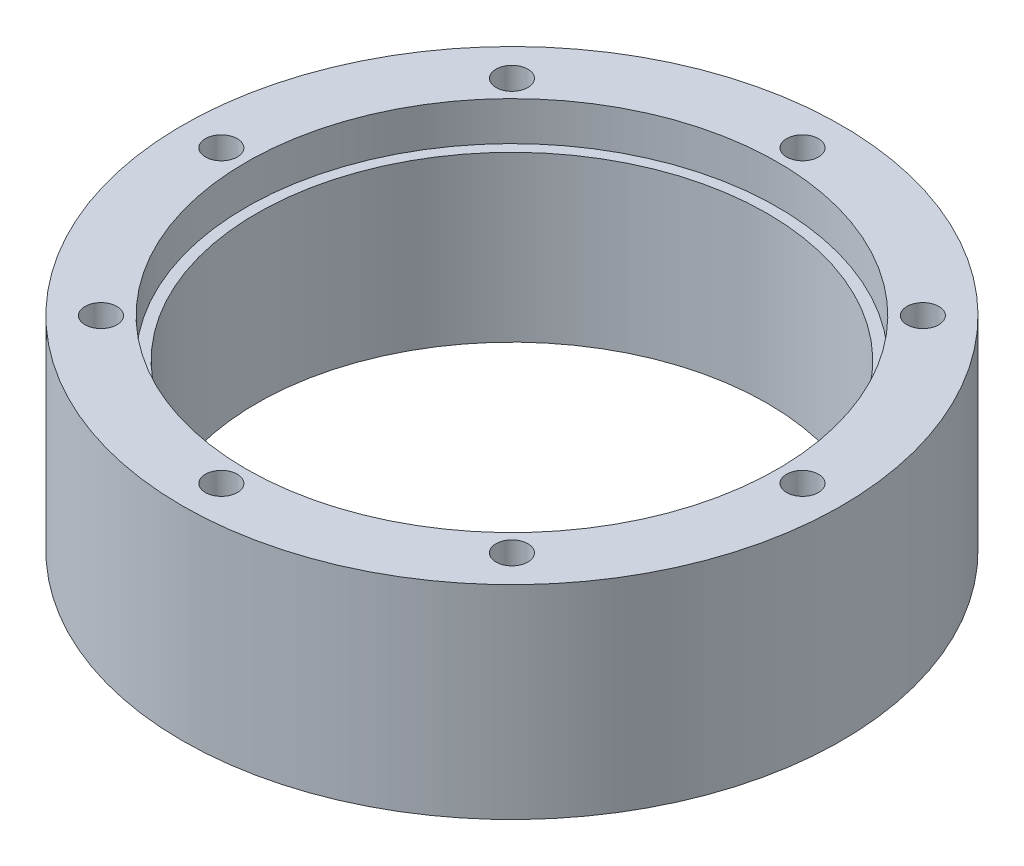
ISO-10303-21;
HEADER;
FILE_DESCRIPTION(('STEP AP214'),'2;1');
FILE_NAME('part.step','',(''),(''),'','','');
FILE_SCHEMA(('AUTOMOTIVE_DESIGN { 1 0 10303 214 1 1 1 1 }'));
ENDSEC;
DATA;
#1=APPLICATION_CONTEXT('core data for automotive mechanical design processes');
#2=APPLICATION_PROTOCOL_DEFINITION('international standard','automotive_design',2000,#1);
#3=PRODUCT_CONTEXT('',#1,'mechanical');
#4=PRODUCT('Part','Part','',(#3));
#5=PRODUCT_RELATED_PRODUCT_CATEGORY('part','',(#4));
#6=PRODUCT_DEFINITION_FORMATION('','',#4);
#7=PRODUCT_DEFINITION_CONTEXT('part definition',#1,'design');
#8=PRODUCT_DEFINITION('design','',#6,#7);
#9=PRODUCT_DEFINITION_SHAPE('','',#8);
#10=(LENGTH_UNIT() NAMED_UNIT(*) SI_UNIT(.MILLI.,.METRE.));
#11=(NAMED_UNIT(*) PLANE_ANGLE_UNIT() SI_UNIT($,.RADIAN.));
#12=(NAMED_UNIT(*) SI_UNIT($,.STERADIAN.) SOLID_ANGLE_UNIT());
#13=UNCERTAINTY_MEASURE_WITH_UNIT(LENGTH_MEASURE(1.E-05),#10,'distance_accuracy_value','');
#14=(GEOMETRIC_REPRESENTATION_CONTEXT(3) GLOBAL_UNCERTAINTY_ASSIGNED_CONTEXT((#13)) GLOBAL_UNIT_ASSIGNED_CONTEXT((#10,
#11,#12)) REPRESENTATION_CONTEXT('',''));
#15=CARTESIAN_POINT('',(0.,0.,0.));
#16=DIRECTION('',(0.,0.,1.));
#17=DIRECTION('',(1.,0.,0.));
#18=AXIS2_PLACEMENT_3D('',#15,#16,#17);
#19=CARTESIAN_POINT('',(0.,28.7,0.));
#20=DIRECTION('',(0.,-1.,0.));
#21=DIRECTION('',(0.,0.,-1.));
#22=AXIS2_PLACEMENT_3D('',#19,#20,#21);
#23=CYLINDRICAL_SURFACE('',#22,36.);
#24=CARTESIAN_POINT('',(0.,0.,0.));
#25=DIRECTION('',(0.,1.,0.));
#26=DIRECTION('',(0.,0.,1.));
#27=AXIS2_PLACEMENT_3D('',#24,#25,#26);
#28=CIRCLE('',#27,36.);
#29=CARTESIAN_POINT('',(0.,0.,36.));
#30=VERTEX_POINT('',#29);
#31=EDGE_CURVE('E54',#30,#30,#28,.T.);
#32=ORIENTED_EDGE('',*,*,#31,.F.);
#33=EDGE_LOOP('',(#32));
#34=FACE_BOUND('',#33,.T.);
#35=CARTESIAN_POINT('',(0.,23.2,0.));
#36=DIRECTION('',(0.,1.,0.));
#37=DIRECTION('',(0.,0.,1.));
#38=AXIS2_PLACEMENT_3D('',#35,#36,#37);
#39=CIRCLE('',#38,36.);
#40=CARTESIAN_POINT('',(0.,23.2,36.));
#41=VERTEX_POINT('',#40);
#42=EDGE_CURVE('E110',#41,#41,#39,.T.);
#43=ORIENTED_EDGE('',*,*,#42,.T.);
#44=EDGE_LOOP('',(#43));
#45=FACE_BOUND('',#44,.T.);
#46=ADVANCED_FACE('F43',(#34,#45),#23,.F.);
#47=CARTESIAN_POINT('',(0.,28.7,0.));
#48=DIRECTION('',(0.,1.,0.));
#49=DIRECTION('',(0.,0.,1.));
#50=AXIS2_PLACEMENT_3D('',#47,#48,#49);
#51=PLANE('',#50);
#52=CARTESIAN_POINT('',(0.,28.7,0.));
#53=DIRECTION('',(0.,1.,0.));
#54=DIRECTION('',(0.,0.,1.));
#55=AXIS2_PLACEMENT_3D('',#52,#53,#54);
#56=CIRCLE('',#55,37.5);
#57=CARTESIAN_POINT('',(0.,28.7,37.5));
#58=VERTEX_POINT('',#57);
#59=EDGE_CURVE('E107',#58,#58,#56,.T.);
#60=ORIENTED_EDGE('',*,*,#59,.F.);
#61=EDGE_LOOP('',(#60));
#62=FACE_BOUND('',#61,.T.);
#63=CARTESIAN_POINT('',(0.,28.7,-41.));
#64=DIRECTION('',(0.,1.,0.));
#65=DIRECTION('',(0.,0.,1.));
#66=AXIS2_PLACEMENT_3D('',#63,#64,#65);
#67=CIRCLE('',#66,2.25);
#68=CARTESIAN_POINT('',(0.,28.7,-38.75));
#69=VERTEX_POINT('',#68);
#70=EDGE_CURVE('E102',#69,#69,#67,.T.);
#71=ORIENTED_EDGE('',*,*,#70,.F.);
#72=EDGE_LOOP('',(#71));
#73=FACE_BOUND('',#72,.T.);
#74=CARTESIAN_POINT('',(28.991378028649,28.7,-28.9913780286484));
#75=DIRECTION('',(0.,1.,0.));
#76=DIRECTION('',(0.,0.,1.));
#77=AXIS2_PLACEMENT_3D('',#74,#75,#76);
#78=CIRCLE('',#77,2.25);
#79=CARTESIAN_POINT('',(28.991378028649,28.7,-26.7413780286484));
#80=VERTEX_POINT('',#79);
#81=EDGE_CURVE('E99',#80,#80,#78,.T.);
#82=ORIENTED_EDGE('',*,*,#81,.F.);
#83=EDGE_LOOP('',(#82));
#84=FACE_BOUND('',#83,.T.);
#85=CARTESIAN_POINT('',(41.0000000000009,28.7,3.57978890157532E-13));
#86=DIRECTION('',(0.,1.,0.));
#87=DIRECTION('',(0.,0.,1.));
#88=AXIS2_PLACEMENT_3D('',#85,#86,#87);
#89=CIRCLE('',#88,2.25);
#90=CARTESIAN_POINT('',(41.0000000000009,28.7,2.25000000000036));
#91=VERTEX_POINT('',#90);
#92=EDGE_CURVE('E93',#91,#91,#89,.T.);
#93=ORIENTED_EDGE('',*,*,#92,.F.);
#94=EDGE_LOOP('',(#93));
#95=FACE_BOUND('',#94,.T.);
#96=CARTESIAN_POINT('',(28.9913780286484,28.7,28.9913780286484));
#97=DIRECTION('',(0.,1.,0.));
#98=DIRECTION('',(0.,0.,1.));
#99=AXIS2_PLACEMENT_3D('',#96,#97,#98);
#100=CIRCLE('',#99,2.25);
#101=CARTESIAN_POINT('',(28.9913780286484,28.7,31.2413780286484));
#102=VERTEX_POINT('',#101);
#103=EDGE_CURVE('E87',#102,#102,#100,.T.);
#104=ORIENTED_EDGE('',*,*,#103,.F.);
#105=EDGE_LOOP('',(#104));
#106=FACE_BOUND('',#105,.T.);
#107=CARTESIAN_POINT('',(0.,28.7,41.));
#108=DIRECTION('',(0.,1.,0.));
#109=DIRECTION('',(0.,0.,1.));
#110=AXIS2_PLACEMENT_3D('',#107,#108,#109);
#111=CIRCLE('',#110,2.25);
#112=CARTESIAN_POINT('',(0.,28.7,43.25));
#113=VERTEX_POINT('',#112);
#114=EDGE_CURVE('E81',#113,#113,#111,.T.);
#115=ORIENTED_EDGE('',*,*,#114,.F.);
#116=EDGE_LOOP('',(#115));
#117=FACE_BOUND('',#116,.T.);
#118=CARTESIAN_POINT('',(-28.9913780286484,28.7,28.9913780286485));
#119=DIRECTION('',(0.,1.,0.));
#120=DIRECTION('',(0.,0.,1.));
#121=AXIS2_PLACEMENT_3D('',#118,#119,#120);
#122=CIRCLE('',#121,2.25);
#123=CARTESIAN_POINT('',(-28.9913780286484,28.7,31.2413780286485));
#124=VERTEX_POINT('',#123);
#125=EDGE_CURVE('E75',#124,#124,#122,.T.);
#126=ORIENTED_EDGE('',*,*,#125,.F.);
#127=EDGE_LOOP('',(#126));
#128=FACE_BOUND('',#127,.T.);
#129=CARTESIAN_POINT('',(-41.,28.7,0.));
#130=DIRECTION('',(0.,1.,0.));
#131=DIRECTION('',(0.,0.,1.));
#132=AXIS2_PLACEMENT_3D('',#129,#130,#131);
#133=CIRCLE('',#132,2.25);
#134=CARTESIAN_POINT('',(-41.,28.7,2.25000000000001));
#135=VERTEX_POINT('',#134);
#136=EDGE_CURVE('E69',#135,#135,#133,.T.);
#137=ORIENTED_EDGE('',*,*,#136,.F.);
#138=EDGE_LOOP('',(#137));
#139=FACE_BOUND('',#138,.T.);
#140=CARTESIAN_POINT('',(-28.9913780286488,28.7,-28.9913780286481));
#141=DIRECTION('',(0.,1.,0.));
#142=DIRECTION('',(0.,0.,1.));
#143=AXIS2_PLACEMENT_3D('',#140,#141,#142);
#144=CIRCLE('',#143,2.25);
#145=CARTESIAN_POINT('',(-28.9913780286488,28.7,-26.7413780286481));
#146=VERTEX_POINT('',#145);
#147=EDGE_CURVE('E62',#146,#146,#144,.T.);
#148=ORIENTED_EDGE('',*,*,#147,.F.);
#149=EDGE_LOOP('',(#148));
#150=FACE_BOUND('',#149,.T.);
#151=CARTESIAN_POINT('',(0.,28.7,0.));
#152=DIRECTION('',(0.,1.,0.));
#153=DIRECTION('',(0.,0.,1.));
#154=AXIS2_PLACEMENT_3D('',#151,#152,#153);
#155=CIRCLE('',#154,46.5);
#156=CARTESIAN_POINT('',(0.,28.7,46.5));
#157=VERTEX_POINT('',#156);
#158=EDGE_CURVE('E10',#157,#157,#155,.T.);
#159=ORIENTED_EDGE('',*,*,#158,.T.);
#160=EDGE_LOOP('',(#159));
#161=FACE_BOUND('',#160,.T.);
#162=ADVANCED_FACE('F130',(#62,#73,#84,#95,#106,#117,#128,#139,#150,#161),#51,.T.);
#163=CARTESIAN_POINT('',(0.,0.,0.));
#164=DIRECTION('',(0.,1.,0.));
#165=DIRECTION('',(0.,0.,1.));
#166=AXIS2_PLACEMENT_3D('',#163,#164,#165);
#167=PLANE('',#166);
#168=CARTESIAN_POINT('',(0.,0.,-41.));
#169=DIRECTION('',(0.,1.,0.));
#170=DIRECTION('',(0.,0.,1.));
#171=AXIS2_PLACEMENT_3D('',#168,#169,#170);
#172=CIRCLE('',#171,2.25);
#173=CARTESIAN_POINT('',(0.,0.,-38.75));
#174=VERTEX_POINT('',#173);
#175=EDGE_CURVE('E58',#174,#174,#172,.T.);
#176=ORIENTED_EDGE('',*,*,#175,.T.);
#177=EDGE_LOOP('',(#176));
#178=FACE_BOUND('',#177,.T.);
#179=CARTESIAN_POINT('',(28.991378028649,0.,-28.9913780286484));
#180=DIRECTION('',(0.,1.,0.));
#181=DIRECTION('',(0.,0.,1.));
#182=AXIS2_PLACEMENT_3D('',#179,#180,#181);
#183=CIRCLE('',#182,2.25);
#184=CARTESIAN_POINT('',(28.991378028649,0.,-26.7413780286484));
#185=VERTEX_POINT('',#184);
#186=EDGE_CURVE('E96',#185,#185,#183,.T.);
#187=ORIENTED_EDGE('',*,*,#186,.T.);
#188=EDGE_LOOP('',(#187));
#189=FACE_BOUND('',#188,.T.);
#190=CARTESIAN_POINT('',(41.0000000000009,0.,3.57978890157532E-13));
#191=DIRECTION('',(0.,1.,0.));
#192=DIRECTION('',(0.,0.,1.));
#193=AXIS2_PLACEMENT_3D('',#190,#191,#192);
#194=CIRCLE('',#193,2.25);
#195=CARTESIAN_POINT('',(41.0000000000009,0.,2.25000000000036));
#196=VERTEX_POINT('',#195);
#197=EDGE_CURVE('E90',#196,#196,#194,.T.);
#198=ORIENTED_EDGE('',*,*,#197,.T.);
#199=EDGE_LOOP('',(#198));
#200=FACE_BOUND('',#199,.T.);
#201=CARTESIAN_POINT('',(28.9913780286484,0.,28.9913780286484));
#202=DIRECTION('',(0.,1.,0.));
#203=DIRECTION('',(0.,0.,1.));
#204=AXIS2_PLACEMENT_3D('',#201,#202,#203);
#205=CIRCLE('',#204,2.25);
#206=CARTESIAN_POINT('',(28.9913780286484,0.,31.2413780286484));
#207=VERTEX_POINT('',#206);
#208=EDGE_CURVE('E84',#207,#207,#205,.T.);
#209=ORIENTED_EDGE('',*,*,#208,.T.);
#210=EDGE_LOOP('',(#209));
#211=FACE_BOUND('',#210,.T.);
#212=CARTESIAN_POINT('',(0.,0.,41.));
#213=DIRECTION('',(0.,1.,0.));
#214=DIRECTION('',(0.,0.,1.));
#215=AXIS2_PLACEMENT_3D('',#212,#213,#214);
#216=CIRCLE('',#215,2.25);
#217=CARTESIAN_POINT('',(0.,0.,43.25));
#218=VERTEX_POINT('',#217);
#219=EDGE_CURVE('E78',#218,#218,#216,.T.);
#220=ORIENTED_EDGE('',*,*,#219,.T.);
#221=EDGE_LOOP('',(#220));
#222=FACE_BOUND('',#221,.T.);
#223=CARTESIAN_POINT('',(-28.9913780286484,0.,28.9913780286485));
#224=DIRECTION('',(0.,1.,0.));
#225=DIRECTION('',(0.,0.,1.));
#226=AXIS2_PLACEMENT_3D('',#223,#224,#225);
#227=CIRCLE('',#226,2.25);
#228=CARTESIAN_POINT('',(-28.9913780286484,0.,31.2413780286485));
#229=VERTEX_POINT('',#228);
#230=EDGE_CURVE('E72',#229,#229,#227,.T.);
#231=ORIENTED_EDGE('',*,*,#230,.T.);
#232=EDGE_LOOP('',(#231));
#233=FACE_BOUND('',#232,.T.);
#234=CARTESIAN_POINT('',(-41.,0.,0.));
#235=DIRECTION('',(0.,1.,0.));
#236=DIRECTION('',(0.,0.,1.));
#237=AXIS2_PLACEMENT_3D('',#234,#235,#236);
#238=CIRCLE('',#237,2.25);
#239=CARTESIAN_POINT('',(-41.,0.,2.25000000000001));
#240=VERTEX_POINT('',#239);
#241=EDGE_CURVE('E66',#240,#240,#238,.T.);
#242=ORIENTED_EDGE('',*,*,#241,.T.);
#243=EDGE_LOOP('',(#242));
#244=FACE_BOUND('',#243,.T.);
#245=CARTESIAN_POINT('',(-28.9913780286488,0.,-28.9913780286481));
#246=DIRECTION('',(0.,1.,0.));
#247=DIRECTION('',(0.,0.,1.));
#248=AXIS2_PLACEMENT_3D('',#245,#246,#247);
#249=CIRCLE('',#248,2.25);
#250=CARTESIAN_POINT('',(-28.9913780286488,0.,-26.7413780286481));
#251=VERTEX_POINT('',#250);
#252=EDGE_CURVE('E59',#251,#251,#249,.T.);
#253=ORIENTED_EDGE('',*,*,#252,.T.);
#254=EDGE_LOOP('',(#253));
#255=FACE_BOUND('',#254,.T.);
#256=CARTESIAN_POINT('',(0.,0.,0.));
#257=DIRECTION('',(0.,1.,0.));
#258=DIRECTION('',(0.,0.,1.));
#259=AXIS2_PLACEMENT_3D('',#256,#257,#258);
#260=CIRCLE('',#259,46.5);
#261=CARTESIAN_POINT('',(0.,0.,46.5));
#262=VERTEX_POINT('',#261);
#263=EDGE_CURVE('E47',#262,#262,#260,.T.);
#264=ORIENTED_EDGE('',*,*,#263,.F.);
#265=EDGE_LOOP('',(#264));
#266=FACE_BOUND('',#265,.T.);
#267=ORIENTED_EDGE('',*,*,#31,.T.);
#268=EDGE_LOOP('',(#267));
#269=FACE_BOUND('',#268,.T.);
#270=ADVANCED_FACE('F133',(#178,#189,#200,#211,#222,#233,#244,#255,#266,#269),#167,.F.);
#271=CARTESIAN_POINT('',(0.,28.7,0.));
#272=DIRECTION('',(0.,-1.,0.));
#273=DIRECTION('',(0.,0.,-1.));
#274=AXIS2_PLACEMENT_3D('',#271,#272,#273);
#275=CYLINDRICAL_SURFACE('',#274,46.5);
#276=ORIENTED_EDGE('',*,*,#158,.F.);
#277=EDGE_LOOP('',(#276));
#278=FACE_BOUND('',#277,.T.);
#279=ORIENTED_EDGE('',*,*,#263,.T.);
#280=EDGE_LOOP('',(#279));
#281=FACE_BOUND('',#280,.T.);
#282=ADVANCED_FACE('F45',(#278,#281),#275,.T.);
#283=CARTESIAN_POINT('',(-28.9913780286488,0.,-28.9913780286481));
#284=DIRECTION('',(0.,1.,0.));
#285=DIRECTION('',(0.,0.,1.));
#286=AXIS2_PLACEMENT_3D('',#283,#284,#285);
#287=CYLINDRICAL_SURFACE('',#286,2.25);
#288=ORIENTED_EDGE('',*,*,#252,.F.);
#289=EDGE_LOOP('',(#288));
#290=FACE_BOUND('',#289,.T.);
#291=ORIENTED_EDGE('',*,*,#147,.T.);
#292=EDGE_LOOP('',(#291));
#293=FACE_BOUND('',#292,.T.);
#294=ADVANCED_FACE('F151',(#290,#293),#287,.F.);
#295=CARTESIAN_POINT('',(-41.,0.,0.));
#296=DIRECTION('',(0.,1.,0.));
#297=DIRECTION('',(0.,0.,1.));
#298=AXIS2_PLACEMENT_3D('',#295,#296,#297);
#299=CYLINDRICAL_SURFACE('',#298,2.25);
#300=ORIENTED_EDGE('',*,*,#241,.F.);
#301=EDGE_LOOP('',(#300));
#302=FACE_BOUND('',#301,.T.);
#303=ORIENTED_EDGE('',*,*,#136,.T.);
#304=EDGE_LOOP('',(#303));
#305=FACE_BOUND('',#304,.T.);
#306=ADVANCED_FACE('F153',(#302,#305),#299,.F.);
#307=CARTESIAN_POINT('',(-28.9913780286484,0.,28.9913780286485));
#308=DIRECTION('',(0.,1.,0.));
#309=DIRECTION('',(0.,0.,1.));
#310=AXIS2_PLACEMENT_3D('',#307,#308,#309);
#311=CYLINDRICAL_SURFACE('',#310,2.25);
#312=ORIENTED_EDGE('',*,*,#230,.F.);
#313=EDGE_LOOP('',(#312));
#314=FACE_BOUND('',#313,.T.);
#315=ORIENTED_EDGE('',*,*,#125,.T.);
#316=EDGE_LOOP('',(#315));
#317=FACE_BOUND('',#316,.T.);
#318=ADVANCED_FACE('F160',(#314,#317),#311,.F.);
#319=CARTESIAN_POINT('',(0.,0.,41.));
#320=DIRECTION('',(0.,1.,0.));
#321=DIRECTION('',(0.,0.,1.));
#322=AXIS2_PLACEMENT_3D('',#319,#320,#321);
#323=CYLINDRICAL_SURFACE('',#322,2.25);
#324=ORIENTED_EDGE('',*,*,#219,.F.);
#325=EDGE_LOOP('',(#324));
#326=FACE_BOUND('',#325,.T.);
#327=ORIENTED_EDGE('',*,*,#114,.T.);
#328=EDGE_LOOP('',(#327));
#329=FACE_BOUND('',#328,.T.);
#330=ADVANCED_FACE('F198',(#326,#329),#323,.F.);
#331=CARTESIAN_POINT('',(28.9913780286484,0.,28.9913780286484));
#332=DIRECTION('',(0.,1.,0.));
#333=DIRECTION('',(0.,0.,1.));
#334=AXIS2_PLACEMENT_3D('',#331,#332,#333);
#335=CYLINDRICAL_SURFACE('',#334,2.25);
#336=ORIENTED_EDGE('',*,*,#208,.F.);
#337=EDGE_LOOP('',(#336));
#338=FACE_BOUND('',#337,.T.);
#339=ORIENTED_EDGE('',*,*,#103,.T.);
#340=EDGE_LOOP('',(#339));
#341=FACE_BOUND('',#340,.T.);
#342=ADVANCED_FACE('F203',(#338,#341),#335,.F.);
#343=CARTESIAN_POINT('',(41.0000000000009,0.,3.57978890157532E-13));
#344=DIRECTION('',(0.,1.,0.));
#345=DIRECTION('',(0.,0.,1.));
#346=AXIS2_PLACEMENT_3D('',#343,#344,#345);
#347=CYLINDRICAL_SURFACE('',#346,2.25);
#348=ORIENTED_EDGE('',*,*,#197,.F.);
#349=EDGE_LOOP('',(#348));
#350=FACE_BOUND('',#349,.T.);
#351=ORIENTED_EDGE('',*,*,#92,.T.);
#352=EDGE_LOOP('',(#351));
#353=FACE_BOUND('',#352,.T.);
#354=ADVANCED_FACE('F209',(#350,#353),#347,.F.);
#355=CARTESIAN_POINT('',(28.991378028649,0.,-28.9913780286484));
#356=DIRECTION('',(0.,1.,0.));
#357=DIRECTION('',(0.,0.,1.));
#358=AXIS2_PLACEMENT_3D('',#355,#356,#357);
#359=CYLINDRICAL_SURFACE('',#358,2.25);
#360=ORIENTED_EDGE('',*,*,#186,.F.);
#361=EDGE_LOOP('',(#360));
#362=FACE_BOUND('',#361,.T.);
#363=ORIENTED_EDGE('',*,*,#81,.T.);
#364=EDGE_LOOP('',(#363));
#365=FACE_BOUND('',#364,.T.);
#366=ADVANCED_FACE('F213',(#362,#365),#359,.F.);
#367=CARTESIAN_POINT('',(0.,0.,-41.));
#368=DIRECTION('',(0.,1.,0.));
#369=DIRECTION('',(0.,0.,1.));
#370=AXIS2_PLACEMENT_3D('',#367,#368,#369);
#371=CYLINDRICAL_SURFACE('',#370,2.25);
#372=ORIENTED_EDGE('',*,*,#175,.F.);
#373=EDGE_LOOP('',(#372));
#374=FACE_BOUND('',#373,.T.);
#375=ORIENTED_EDGE('',*,*,#70,.T.);
#376=EDGE_LOOP('',(#375));
#377=FACE_BOUND('',#376,.T.);
#378=ADVANCED_FACE('F126',(#374,#377),#371,.F.);
#379=CARTESIAN_POINT('',(0.,23.2,0.));
#380=DIRECTION('',(0.,1.,0.));
#381=DIRECTION('',(0.,0.,1.));
#382=AXIS2_PLACEMENT_3D('',#379,#380,#381);
#383=CYLINDRICAL_SURFACE('',#382,37.5);
#384=CARTESIAN_POINT('',(0.,23.2,0.));
#385=DIRECTION('',(0.,1.,0.));
#386=DIRECTION('',(0.,0.,1.));
#387=AXIS2_PLACEMENT_3D('',#384,#385,#386);
#388=CIRCLE('',#387,37.5);
#389=CARTESIAN_POINT('',(0.,23.2,37.5));
#390=VERTEX_POINT('',#389);
#391=EDGE_CURVE('E63',#390,#390,#388,.T.);
#392=ORIENTED_EDGE('',*,*,#391,.F.);
#393=EDGE_LOOP('',(#392));
#394=FACE_BOUND('',#393,.T.);
#395=ORIENTED_EDGE('',*,*,#59,.T.);
#396=EDGE_LOOP('',(#395));
#397=FACE_BOUND('',#396,.T.);
#398=ADVANCED_FACE('F120',(#394,#397),#383,.F.);
#399=CARTESIAN_POINT('',(0.,23.2,0.));
#400=DIRECTION('',(0.,1.,0.));
#401=DIRECTION('',(0.,0.,1.));
#402=AXIS2_PLACEMENT_3D('',#399,#400,#401);
#403=PLANE('',#402);
#404=ORIENTED_EDGE('',*,*,#42,.F.);
#405=EDGE_LOOP('',(#404));
#406=FACE_BOUND('',#405,.T.);
#407=ORIENTED_EDGE('',*,*,#391,.T.);
#408=EDGE_LOOP('',(#407));
#409=FACE_BOUND('',#408,.T.);
#410=ADVANCED_FACE('F117',(#406,#409),#403,.T.);
#411=CLOSED_SHELL('',(#46,#162,#270,#282,#294,#306,#318,#330,#342,#354,#366,#378,#398,#410));
#412=MANIFOLD_SOLID_BREP('B2',#411);
#413=ADVANCED_BREP_SHAPE_REPRESENTATION('',(#18,#412),#14);
#414=SHAPE_DEFINITION_REPRESENTATION(#9,#413);
ENDSEC;
END-ISO-10303-21;
